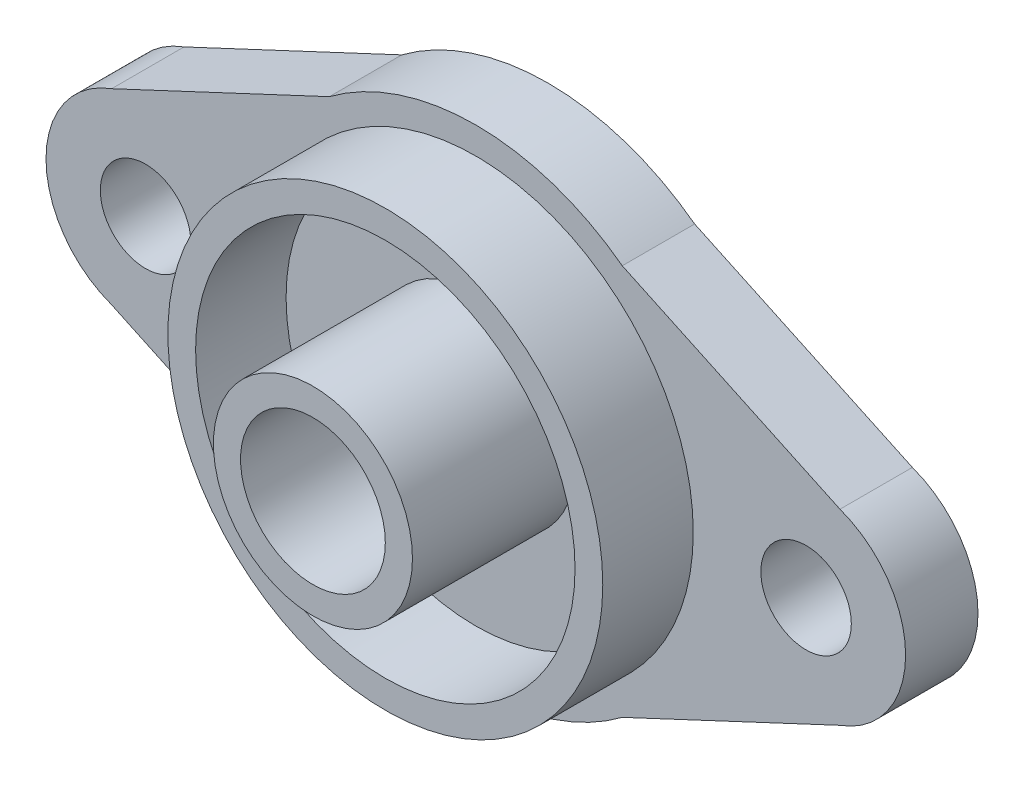
ISO-10303-21;
HEADER;
FILE_DESCRIPTION(('STEP AP214'),'2;1');
FILE_NAME('part.step','',(''),(''),'','','');
FILE_SCHEMA(('AUTOMOTIVE_DESIGN { 1 0 10303 214 1 1 1 1 }'));
ENDSEC;
DATA;
#1=APPLICATION_CONTEXT('core data for automotive mechanical design processes');
#2=APPLICATION_PROTOCOL_DEFINITION('international standard','automotive_design',2000,#1);
#3=PRODUCT_CONTEXT('',#1,'mechanical');
#4=PRODUCT('Part','Part','',(#3));
#5=PRODUCT_RELATED_PRODUCT_CATEGORY('part','',(#4));
#6=PRODUCT_DEFINITION_FORMATION('','',#4);
#7=PRODUCT_DEFINITION_CONTEXT('part definition',#1,'design');
#8=PRODUCT_DEFINITION('design','',#6,#7);
#9=PRODUCT_DEFINITION_SHAPE('','',#8);
#10=(LENGTH_UNIT() NAMED_UNIT(*) SI_UNIT(.MILLI.,.METRE.));
#11=(NAMED_UNIT(*) PLANE_ANGLE_UNIT() SI_UNIT($,.RADIAN.));
#12=(NAMED_UNIT(*) SI_UNIT($,.STERADIAN.) SOLID_ANGLE_UNIT());
#13=UNCERTAINTY_MEASURE_WITH_UNIT(LENGTH_MEASURE(1.E-05),#10,'distance_accuracy_value','');
#14=(GEOMETRIC_REPRESENTATION_CONTEXT(3) GLOBAL_UNCERTAINTY_ASSIGNED_CONTEXT((#13)) GLOBAL_UNIT_ASSIGNED_CONTEXT((#10,
#11,#12)) REPRESENTATION_CONTEXT('',''));
#15=CARTESIAN_POINT('',(0.,0.,0.));
#16=DIRECTION('',(0.,0.,1.));
#17=DIRECTION('',(1.,0.,0.));
#18=AXIS2_PLACEMENT_3D('',#15,#16,#17);
#19=CARTESIAN_POINT('',(0.,0.,4.));
#20=DIRECTION('',(0.,0.,1.));
#21=DIRECTION('',(1.,0.,0.));
#22=AXIS2_PLACEMENT_3D('',#19,#20,#21);
#23=PLANE('',#22);
#24=CARTESIAN_POINT('',(0.,0.,4.));
#25=DIRECTION('',(0.,0.,1.));
#26=DIRECTION('',(1.,0.,0.));
#27=AXIS2_PLACEMENT_3D('',#24,#25,#26);
#28=CIRCLE('',#27,10.4838418302343);
#29=CARTESIAN_POINT('',(10.4838418302343,0.,4.));
#30=VERTEX_POINT('',#29);
#31=EDGE_CURVE('E11',#30,#30,#28,.F.);
#32=ORIENTED_EDGE('',*,*,#31,.F.);
#33=EDGE_LOOP('',(#32));
#34=FACE_BOUND('',#33,.T.);
#35=CARTESIAN_POINT('',(0.,0.,4.));
#36=DIRECTION('',(0.,0.,1.));
#37=DIRECTION('',(1.,0.,0.));
#38=AXIS2_PLACEMENT_3D('',#35,#36,#37);
#39=CIRCLE('',#38,5.5);
#40=CARTESIAN_POINT('',(5.5,0.,4.));
#41=VERTEX_POINT('',#40);
#42=EDGE_CURVE('E210',#41,#41,#39,.T.);
#43=ORIENTED_EDGE('',*,*,#42,.F.);
#44=EDGE_LOOP('',(#43));
#45=FACE_BOUND('',#44,.T.);
#46=ADVANCED_FACE('F34',(#34,#45),#23,.T.);
#47=CARTESIAN_POINT('',(0.,0.,4.));
#48=DIRECTION('',(0.,0.,1.));
#49=DIRECTION('',(1.,0.,0.));
#50=AXIS2_PLACEMENT_3D('',#47,#48,#49);
#51=CIRCLE('',#50,12.0157010316924);
#52=CARTESIAN_POINT('',(12.0157010316924,0.,4.));
#53=VERTEX_POINT('',#52);
#54=EDGE_CURVE('E201',#53,#53,#51,.T.);
#55=ORIENTED_EDGE('',*,*,#54,.F.);
#56=EDGE_LOOP('',(#55));
#57=FACE_BOUND('',#56,.T.);
#58=CARTESIAN_POINT('',(-18.25,0.,4.));
#59=DIRECTION('',(0.,0.,1.));
#60=DIRECTION('',(1.,0.,0.));
#61=AXIS2_PLACEMENT_3D('',#58,#59,#60);
#62=CIRCLE('',#61,2.5);
#63=CARTESIAN_POINT('',(-15.75,0.,4.));
#64=VERTEX_POINT('',#63);
#65=EDGE_CURVE('E188',#64,#64,#62,.T.);
#66=ORIENTED_EDGE('',*,*,#65,.F.);
#67=EDGE_LOOP('',(#66));
#68=FACE_BOUND('',#67,.T.);
#69=CARTESIAN_POINT('',(0.,0.,4.));
#70=DIRECTION('',(0.,0.,1.));
#71=DIRECTION('',(1.,0.,0.));
#72=AXIS2_PLACEMENT_3D('',#69,#70,#71);
#73=CIRCLE('',#72,13.5);
#74=CARTESIAN_POINT('',(8.09371855645499,10.8047082296976,4.));
#75=VERTEX_POINT('',#74);
#76=CARTESIAN_POINT('',(-8.09371855645499,10.8047082296976,4.));
#77=VERTEX_POINT('',#76);
#78=EDGE_CURVE('E148',#75,#77,#73,.T.);
#79=ORIENTED_EDGE('',*,*,#78,.T.);
#80=DIRECTION('',(-0.905614457047398,-0.424101939616817,0.));
#81=VECTOR('',#80,1.);
#82=CARTESIAN_POINT('',(-20.1239972704098,5.17089298192262,4.));
#83=LINE('',#82,#81);
#84=CARTESIAN_POINT('',(-20.1239972704098,5.17089298192262,4.));
#85=VERTEX_POINT('',#84);
#86=EDGE_CURVE('E95',#77,#85,#83,.T.);
#87=ORIENTED_EDGE('',*,*,#86,.T.);
#88=CARTESIAN_POINT('',(-18.25,0.,4.));
#89=DIRECTION('',(0.,0.,1.));
#90=DIRECTION('',(1.,0.,0.));
#91=AXIS2_PLACEMENT_3D('',#88,#89,#90);
#92=CIRCLE('',#91,5.5);
#93=CARTESIAN_POINT('',(-20.1239972704098,-5.17089298192262,4.));
#94=VERTEX_POINT('',#93);
#95=EDGE_CURVE('E180',#85,#94,#92,.T.);
#96=ORIENTED_EDGE('',*,*,#95,.T.);
#97=DIRECTION('',(0.905614457047398,-0.424101939616817,0.));
#98=VECTOR('',#97,1.);
#99=CARTESIAN_POINT('',(-20.1239972704098,-5.17089298192262,4.));
#100=LINE('',#99,#98);
#101=CARTESIAN_POINT('',(-8.09371855645499,-10.8047082296976,4.));
#102=VERTEX_POINT('',#101);
#103=EDGE_CURVE('E179',#94,#102,#100,.T.);
#104=ORIENTED_EDGE('',*,*,#103,.T.);
#105=CARTESIAN_POINT('',(0.,0.,4.));
#106=DIRECTION('',(0.,0.,1.));
#107=DIRECTION('',(-1.,0.,0.));
#108=AXIS2_PLACEMENT_3D('',#105,#106,#107);
#109=CIRCLE('',#108,13.5);
#110=CARTESIAN_POINT('',(8.093718556455,-10.8047082296976,4.));
#111=VERTEX_POINT('',#110);
#112=EDGE_CURVE('E115',#102,#111,#109,.T.);
#113=ORIENTED_EDGE('',*,*,#112,.T.);
#114=DIRECTION('',(0.905614457047398,0.424101939616817,0.));
#115=VECTOR('',#114,1.);
#116=CARTESIAN_POINT('',(20.1239972704098,-5.17089298192262,4.));
#117=LINE('',#116,#115);
#118=CARTESIAN_POINT('',(20.1239972704098,-5.17089298192262,4.));
#119=VERTEX_POINT('',#118);
#120=EDGE_CURVE('E108',#111,#119,#117,.T.);
#121=ORIENTED_EDGE('',*,*,#120,.T.);
#122=CARTESIAN_POINT('',(18.25,0.,4.));
#123=DIRECTION('',(0.,0.,1.));
#124=DIRECTION('',(-1.,0.,0.));
#125=AXIS2_PLACEMENT_3D('',#122,#123,#124);
#126=CIRCLE('',#125,5.5);
#127=CARTESIAN_POINT('',(20.1239972704098,5.17089298192262,4.));
#128=VERTEX_POINT('',#127);
#129=EDGE_CURVE('E113',#119,#128,#126,.T.);
#130=ORIENTED_EDGE('',*,*,#129,.T.);
#131=DIRECTION('',(-0.905614457047398,0.424101939616817,0.));
#132=VECTOR('',#131,1.);
#133=CARTESIAN_POINT('',(20.1239972704098,5.17089298192262,4.));
#134=LINE('',#133,#132);
#135=EDGE_CURVE('E51',#128,#75,#134,.T.);
#136=ORIENTED_EDGE('',*,*,#135,.T.);
#137=EDGE_LOOP('',(#79,#87,#96,#104,#113,#121,#130,#136));
#138=FACE_BOUND('',#137,.T.);
#139=CARTESIAN_POINT('',(18.25,0.,4.));
#140=DIRECTION('',(0.,0.,1.));
#141=DIRECTION('',(1.,0.,0.));
#142=AXIS2_PLACEMENT_3D('',#139,#140,#141);
#143=CIRCLE('',#142,2.5);
#144=CARTESIAN_POINT('',(20.75,0.,4.));
#145=VERTEX_POINT('',#144);
#146=EDGE_CURVE('E192',#145,#145,#143,.T.);
#147=ORIENTED_EDGE('',*,*,#146,.F.);
#148=EDGE_LOOP('',(#147));
#149=FACE_BOUND('',#148,.T.);
#150=ADVANCED_FACE('F110',(#57,#68,#138,#149),#23,.T.);
#151=CARTESIAN_POINT('',(0.,0.,0.));
#152=DIRECTION('',(0.,0.,1.));
#153=DIRECTION('',(1.,0.,0.));
#154=AXIS2_PLACEMENT_3D('',#151,#152,#153);
#155=PLANE('',#154);
#156=CARTESIAN_POINT('',(0.,0.,0.));
#157=DIRECTION('',(0.,0.,1.));
#158=DIRECTION('',(1.,0.,0.));
#159=AXIS2_PLACEMENT_3D('',#156,#157,#158);
#160=CIRCLE('',#159,13.5);
#161=CARTESIAN_POINT('',(8.09371855645499,10.8047082296976,0.));
#162=VERTEX_POINT('',#161);
#163=CARTESIAN_POINT('',(-8.09371855645499,10.8047082296976,0.));
#164=VERTEX_POINT('',#163);
#165=EDGE_CURVE('E133',#162,#164,#160,.T.);
#166=ORIENTED_EDGE('',*,*,#165,.F.);
#167=DIRECTION('',(-0.905614457047398,0.424101939616817,0.));
#168=VECTOR('',#167,1.);
#169=CARTESIAN_POINT('',(20.1239972704098,5.17089298192262,0.));
#170=LINE('',#169,#168);
#171=CARTESIAN_POINT('',(20.1239972704098,5.17089298192262,0.));
#172=VERTEX_POINT('',#171);
#173=EDGE_CURVE('E86',#172,#162,#170,.T.);
#174=ORIENTED_EDGE('',*,*,#173,.F.);
#175=CARTESIAN_POINT('',(18.25,0.,0.));
#176=DIRECTION('',(0.,0.,1.));
#177=DIRECTION('',(-1.,0.,0.));
#178=AXIS2_PLACEMENT_3D('',#175,#176,#177);
#179=CIRCLE('',#178,5.5);
#180=CARTESIAN_POINT('',(20.1239972704098,-5.17089298192262,0.));
#181=VERTEX_POINT('',#180);
#182=EDGE_CURVE('E80',#181,#172,#179,.T.);
#183=ORIENTED_EDGE('',*,*,#182,.F.);
#184=DIRECTION('',(0.905614457047398,0.424101939616817,0.));
#185=VECTOR('',#184,1.);
#186=CARTESIAN_POINT('',(20.1239972704098,-5.17089298192262,0.));
#187=LINE('',#186,#185);
#188=CARTESIAN_POINT('',(8.093718556455,-10.8047082296976,0.));
#189=VERTEX_POINT('',#188);
#190=EDGE_CURVE('E123',#189,#181,#187,.T.);
#191=ORIENTED_EDGE('',*,*,#190,.F.);
#192=CARTESIAN_POINT('',(0.,0.,0.));
#193=DIRECTION('',(0.,0.,1.));
#194=DIRECTION('',(-1.,0.,0.));
#195=AXIS2_PLACEMENT_3D('',#192,#193,#194);
#196=CIRCLE('',#195,13.5);
#197=CARTESIAN_POINT('',(-8.09371855645499,-10.8047082296976,0.));
#198=VERTEX_POINT('',#197);
#199=EDGE_CURVE('E143',#198,#189,#196,.T.);
#200=ORIENTED_EDGE('',*,*,#199,.F.);
#201=DIRECTION('',(0.905614457047398,-0.424101939616817,0.));
#202=VECTOR('',#201,1.);
#203=CARTESIAN_POINT('',(-20.1239972704098,-5.17089298192262,0.));
#204=LINE('',#203,#202);
#205=CARTESIAN_POINT('',(-20.1239972704098,-5.17089298192262,0.));
#206=VERTEX_POINT('',#205);
#207=EDGE_CURVE('E141',#206,#198,#204,.T.);
#208=ORIENTED_EDGE('',*,*,#207,.F.);
#209=CARTESIAN_POINT('',(-18.25,0.,0.));
#210=DIRECTION('',(0.,0.,1.));
#211=DIRECTION('',(1.,0.,0.));
#212=AXIS2_PLACEMENT_3D('',#209,#210,#211);
#213=CIRCLE('',#212,5.5);
#214=CARTESIAN_POINT('',(-20.1239972704098,5.17089298192262,0.));
#215=VERTEX_POINT('',#214);
#216=EDGE_CURVE('E139',#215,#206,#213,.T.);
#217=ORIENTED_EDGE('',*,*,#216,.F.);
#218=DIRECTION('',(-0.905614457047398,-0.424101939616817,0.));
#219=VECTOR('',#218,1.);
#220=CARTESIAN_POINT('',(-20.1239972704098,5.17089298192262,0.));
#221=LINE('',#220,#219);
#222=EDGE_CURVE('E136',#164,#215,#221,.T.);
#223=ORIENTED_EDGE('',*,*,#222,.F.);
#224=EDGE_LOOP('',(#166,#174,#183,#191,#200,#208,#217,#223));
#225=FACE_BOUND('',#224,.T.);
#226=CARTESIAN_POINT('',(0.,0.,0.));
#227=DIRECTION('',(0.,0.,1.));
#228=DIRECTION('',(1.,0.,0.));
#229=AXIS2_PLACEMENT_3D('',#226,#227,#228);
#230=CIRCLE('',#229,4.);
#231=CARTESIAN_POINT('',(4.,0.,0.));
#232=VERTEX_POINT('',#231);
#233=EDGE_CURVE('E137',#232,#232,#230,.T.);
#234=ORIENTED_EDGE('',*,*,#233,.T.);
#235=EDGE_LOOP('',(#234));
#236=FACE_BOUND('',#235,.T.);
#237=CARTESIAN_POINT('',(-18.25,0.,0.));
#238=DIRECTION('',(0.,0.,1.));
#239=DIRECTION('',(1.,0.,0.));
#240=AXIS2_PLACEMENT_3D('',#237,#238,#239);
#241=CIRCLE('',#240,2.5);
#242=CARTESIAN_POINT('',(-15.75,0.,0.));
#243=VERTEX_POINT('',#242);
#244=EDGE_CURVE('E189',#243,#243,#241,.T.);
#245=ORIENTED_EDGE('',*,*,#244,.T.);
#246=EDGE_LOOP('',(#245));
#247=FACE_BOUND('',#246,.T.);
#248=CARTESIAN_POINT('',(18.25,0.,0.));
#249=DIRECTION('',(0.,0.,1.));
#250=DIRECTION('',(1.,0.,0.));
#251=AXIS2_PLACEMENT_3D('',#248,#249,#250);
#252=CIRCLE('',#251,2.5);
#253=CARTESIAN_POINT('',(20.75,0.,0.));
#254=VERTEX_POINT('',#253);
#255=EDGE_CURVE('E195',#254,#254,#252,.T.);
#256=ORIENTED_EDGE('',*,*,#255,.T.);
#257=EDGE_LOOP('',(#256));
#258=FACE_BOUND('',#257,.T.);
#259=ADVANCED_FACE('F166',(#225,#236,#247,#258),#155,.F.);
#260=CARTESIAN_POINT('',(0.,0.,4.));
#261=DIRECTION('',(0.,0.,-1.));
#262=DIRECTION('',(-1.,0.,0.));
#263=AXIS2_PLACEMENT_3D('',#260,#261,#262);
#264=CYLINDRICAL_SURFACE('',#263,13.5);
#265=ORIENTED_EDGE('',*,*,#165,.T.);
#266=DIRECTION('',(0.,0.,-1.));
#267=VECTOR('',#266,1.);
#268=CARTESIAN_POINT('',(-8.09371855645499,10.8047082296976,4.));
#269=LINE('',#268,#267);
#270=EDGE_CURVE('E43',#77,#164,#269,.T.);
#271=ORIENTED_EDGE('',*,*,#270,.F.);
#272=ORIENTED_EDGE('',*,*,#78,.F.);
#273=DIRECTION('',(0.,0.,-1.));
#274=VECTOR('',#273,1.);
#275=CARTESIAN_POINT('',(8.09371855645499,10.8047082296976,4.));
#276=LINE('',#275,#274);
#277=EDGE_CURVE('E129',#75,#162,#276,.T.);
#278=ORIENTED_EDGE('',*,*,#277,.T.);
#279=EDGE_LOOP('',(#265,#271,#272,#278));
#280=FACE_BOUND('',#279,.T.);
#281=ADVANCED_FACE('F36',(#280),#264,.T.);
#282=CARTESIAN_POINT('',(-20.1239972704098,5.17089298192262,4.));
#283=DIRECTION('',(0.424101939616817,-0.905614457047398,0.));
#284=DIRECTION('',(0.905614457047398,0.424101939616817,0.));
#285=AXIS2_PLACEMENT_3D('',#282,#283,#284);
#286=PLANE('',#285);
#287=ORIENTED_EDGE('',*,*,#222,.T.);
#288=DIRECTION('',(0.,0.,-1.));
#289=VECTOR('',#288,1.);
#290=CARTESIAN_POINT('',(-20.1239972704098,5.17089298192262,4.));
#291=LINE('',#290,#289);
#292=EDGE_CURVE('E158',#85,#215,#291,.T.);
#293=ORIENTED_EDGE('',*,*,#292,.F.);
#294=ORIENTED_EDGE('',*,*,#86,.F.);
#295=ORIENTED_EDGE('',*,*,#270,.T.);
#296=EDGE_LOOP('',(#287,#293,#294,#295));
#297=FACE_BOUND('',#296,.T.);
#298=ADVANCED_FACE('F161',(#297),#286,.F.);
#299=CARTESIAN_POINT('',(-18.25,0.,4.));
#300=DIRECTION('',(0.,0.,-1.));
#301=DIRECTION('',(-1.,0.,0.));
#302=AXIS2_PLACEMENT_3D('',#299,#300,#301);
#303=CYLINDRICAL_SURFACE('',#302,5.5);
#304=ORIENTED_EDGE('',*,*,#216,.T.);
#305=DIRECTION('',(0.,0.,-1.));
#306=VECTOR('',#305,1.);
#307=CARTESIAN_POINT('',(-20.1239972704098,-5.17089298192262,4.));
#308=LINE('',#307,#306);
#309=EDGE_CURVE('E155',#94,#206,#308,.T.);
#310=ORIENTED_EDGE('',*,*,#309,.F.);
#311=ORIENTED_EDGE('',*,*,#95,.F.);
#312=ORIENTED_EDGE('',*,*,#292,.T.);
#313=EDGE_LOOP('',(#304,#310,#311,#312));
#314=FACE_BOUND('',#313,.T.);
#315=ADVANCED_FACE('F173',(#314),#303,.T.);
#316=CARTESIAN_POINT('',(-20.1239972704098,-5.17089298192262,4.));
#317=DIRECTION('',(0.424101939616817,0.905614457047398,0.));
#318=DIRECTION('',(-0.905614457047398,0.424101939616817,0.));
#319=AXIS2_PLACEMENT_3D('',#316,#317,#318);
#320=PLANE('',#319);
#321=ORIENTED_EDGE('',*,*,#207,.T.);
#322=DIRECTION('',(0.,0.,-1.));
#323=VECTOR('',#322,1.);
#324=CARTESIAN_POINT('',(-8.09371855645499,-10.8047082296976,4.));
#325=LINE('',#324,#323);
#326=EDGE_CURVE('E152',#102,#198,#325,.T.);
#327=ORIENTED_EDGE('',*,*,#326,.F.);
#328=ORIENTED_EDGE('',*,*,#103,.F.);
#329=ORIENTED_EDGE('',*,*,#309,.T.);
#330=EDGE_LOOP('',(#321,#327,#328,#329));
#331=FACE_BOUND('',#330,.T.);
#332=ADVANCED_FACE('F177',(#331),#320,.F.);
#333=CARTESIAN_POINT('',(0.,0.,4.));
#334=DIRECTION('',(0.,0.,-1.));
#335=DIRECTION('',(-1.,0.,0.));
#336=AXIS2_PLACEMENT_3D('',#333,#334,#335);
#337=CYLINDRICAL_SURFACE('',#336,13.5);
#338=ORIENTED_EDGE('',*,*,#199,.T.);
#339=DIRECTION('',(0.,0.,-1.));
#340=VECTOR('',#339,1.);
#341=CARTESIAN_POINT('',(8.093718556455,-10.8047082296976,4.));
#342=LINE('',#341,#340);
#343=EDGE_CURVE('E124',#111,#189,#342,.T.);
#344=ORIENTED_EDGE('',*,*,#343,.F.);
#345=ORIENTED_EDGE('',*,*,#112,.F.);
#346=ORIENTED_EDGE('',*,*,#326,.T.);
#347=EDGE_LOOP('',(#338,#344,#345,#346));
#348=FACE_BOUND('',#347,.T.);
#349=ADVANCED_FACE('F257',(#348),#337,.T.);
#350=CARTESIAN_POINT('',(20.1239972704098,-5.17089298192262,4.));
#351=DIRECTION('',(-0.424101939616817,0.905614457047398,0.));
#352=DIRECTION('',(-0.905614457047398,-0.424101939616817,0.));
#353=AXIS2_PLACEMENT_3D('',#350,#351,#352);
#354=PLANE('',#353);
#355=ORIENTED_EDGE('',*,*,#190,.T.);
#356=DIRECTION('',(0.,0.,-1.));
#357=VECTOR('',#356,1.);
#358=CARTESIAN_POINT('',(20.1239972704098,-5.17089298192262,4.));
#359=LINE('',#358,#357);
#360=EDGE_CURVE('E120',#119,#181,#359,.T.);
#361=ORIENTED_EDGE('',*,*,#360,.F.);
#362=ORIENTED_EDGE('',*,*,#120,.F.);
#363=ORIENTED_EDGE('',*,*,#343,.T.);
#364=EDGE_LOOP('',(#355,#361,#362,#363));
#365=FACE_BOUND('',#364,.T.);
#366=ADVANCED_FACE('F121',(#365),#354,.F.);
#367=CARTESIAN_POINT('',(18.25,0.,4.));
#368=DIRECTION('',(0.,0.,-1.));
#369=DIRECTION('',(-1.,0.,0.));
#370=AXIS2_PLACEMENT_3D('',#367,#368,#369);
#371=CYLINDRICAL_SURFACE('',#370,5.5);
#372=ORIENTED_EDGE('',*,*,#182,.T.);
#373=DIRECTION('',(0.,0.,-1.));
#374=VECTOR('',#373,1.);
#375=CARTESIAN_POINT('',(20.1239972704098,5.17089298192262,4.));
#376=LINE('',#375,#374);
#377=EDGE_CURVE('E125',#128,#172,#376,.T.);
#378=ORIENTED_EDGE('',*,*,#377,.F.);
#379=ORIENTED_EDGE('',*,*,#129,.F.);
#380=ORIENTED_EDGE('',*,*,#360,.T.);
#381=EDGE_LOOP('',(#372,#378,#379,#380));
#382=FACE_BOUND('',#381,.T.);
#383=ADVANCED_FACE('F127',(#382),#371,.T.);
#384=CARTESIAN_POINT('',(20.1239972704098,5.17089298192262,4.));
#385=DIRECTION('',(-0.424101939616817,-0.905614457047398,0.));
#386=DIRECTION('',(0.905614457047398,-0.424101939616817,0.));
#387=AXIS2_PLACEMENT_3D('',#384,#385,#386);
#388=PLANE('',#387);
#389=ORIENTED_EDGE('',*,*,#173,.T.);
#390=ORIENTED_EDGE('',*,*,#277,.F.);
#391=ORIENTED_EDGE('',*,*,#135,.F.);
#392=ORIENTED_EDGE('',*,*,#377,.T.);
#393=EDGE_LOOP('',(#389,#390,#391,#392));
#394=FACE_BOUND('',#393,.T.);
#395=ADVANCED_FACE('F250',(#394),#388,.F.);
#396=CARTESIAN_POINT('',(0.,0.,4.));
#397=DIRECTION('',(0.,0.,-1.));
#398=DIRECTION('',(-1.,0.,0.));
#399=AXIS2_PLACEMENT_3D('',#396,#397,#398);
#400=CYLINDRICAL_SURFACE('',#399,4.);
#401=ORIENTED_EDGE('',*,*,#233,.F.);
#402=EDGE_LOOP('',(#401));
#403=FACE_BOUND('',#402,.T.);
#404=CARTESIAN_POINT('',(0.,0.,13.));
#405=DIRECTION('',(0.,0.,1.));
#406=DIRECTION('',(1.,0.,0.));
#407=AXIS2_PLACEMENT_3D('',#404,#405,#406);
#408=CIRCLE('',#407,4.);
#409=CARTESIAN_POINT('',(4.,0.,13.));
#410=VERTEX_POINT('',#409);
#411=EDGE_CURVE('E213',#410,#410,#408,.T.);
#412=ORIENTED_EDGE('',*,*,#411,.T.);
#413=EDGE_LOOP('',(#412));
#414=FACE_BOUND('',#413,.T.);
#415=ADVANCED_FACE('F219',(#403,#414),#400,.F.);
#416=CARTESIAN_POINT('',(-18.25,0.,4.));
#417=DIRECTION('',(0.,0.,-1.));
#418=DIRECTION('',(-1.,0.,0.));
#419=AXIS2_PLACEMENT_3D('',#416,#417,#418);
#420=CYLINDRICAL_SURFACE('',#419,2.5);
#421=ORIENTED_EDGE('',*,*,#65,.T.);
#422=EDGE_LOOP('',(#421));
#423=FACE_BOUND('',#422,.T.);
#424=ORIENTED_EDGE('',*,*,#244,.F.);
#425=EDGE_LOOP('',(#424));
#426=FACE_BOUND('',#425,.T.);
#427=ADVANCED_FACE('F321',(#423,#426),#420,.F.);
#428=CARTESIAN_POINT('',(18.25,0.,4.));
#429=DIRECTION('',(0.,0.,-1.));
#430=DIRECTION('',(-1.,0.,0.));
#431=AXIS2_PLACEMENT_3D('',#428,#429,#430);
#432=CYLINDRICAL_SURFACE('',#431,2.5);
#433=ORIENTED_EDGE('',*,*,#146,.T.);
#434=EDGE_LOOP('',(#433));
#435=FACE_BOUND('',#434,.T.);
#436=ORIENTED_EDGE('',*,*,#255,.F.);
#437=EDGE_LOOP('',(#436));
#438=FACE_BOUND('',#437,.T.);
#439=ADVANCED_FACE('F284',(#435,#438),#432,.F.);
#440=CARTESIAN_POINT('',(0.,0.,9.));
#441=DIRECTION('',(0.,0.,1.));
#442=DIRECTION('',(1.,0.,0.));
#443=AXIS2_PLACEMENT_3D('',#440,#441,#442);
#444=PLANE('',#443);
#445=CARTESIAN_POINT('',(0.,0.,9.));
#446=DIRECTION('',(0.,0.,1.));
#447=DIRECTION('',(1.,0.,0.));
#448=AXIS2_PLACEMENT_3D('',#445,#446,#447);
#449=CIRCLE('',#448,12.0157010316924);
#450=CARTESIAN_POINT('',(12.0157010316924,0.,9.));
#451=VERTEX_POINT('',#450);
#452=EDGE_CURVE('E198',#451,#451,#449,.T.);
#453=ORIENTED_EDGE('',*,*,#452,.T.);
#454=EDGE_LOOP('',(#453));
#455=FACE_BOUND('',#454,.T.);
#456=CARTESIAN_POINT('',(0.,0.,9.));
#457=DIRECTION('',(0.,0.,1.));
#458=DIRECTION('',(1.,0.,0.));
#459=AXIS2_PLACEMENT_3D('',#456,#457,#458);
#460=CIRCLE('',#459,10.4838418302343);
#461=CARTESIAN_POINT('',(10.4838418302343,0.,9.));
#462=VERTEX_POINT('',#461);
#463=EDGE_CURVE('E204',#462,#462,#460,.T.);
#464=ORIENTED_EDGE('',*,*,#463,.F.);
#465=EDGE_LOOP('',(#464));
#466=FACE_BOUND('',#465,.T.);
#467=ADVANCED_FACE('F289',(#455,#466),#444,.T.);
#468=CARTESIAN_POINT('',(0.,0.,9.));
#469=DIRECTION('',(0.,0.,-1.));
#470=DIRECTION('',(-1.,0.,0.));
#471=AXIS2_PLACEMENT_3D('',#468,#469,#470);
#472=CYLINDRICAL_SURFACE('',#471,12.0157010316924);
#473=ORIENTED_EDGE('',*,*,#452,.F.);
#474=EDGE_LOOP('',(#473));
#475=FACE_BOUND('',#474,.T.);
#476=ORIENTED_EDGE('',*,*,#54,.T.);
#477=EDGE_LOOP('',(#476));
#478=FACE_BOUND('',#477,.T.);
#479=ADVANCED_FACE('F233',(#475,#478),#472,.T.);
#480=CARTESIAN_POINT('',(0.,0.,9.));
#481=DIRECTION('',(0.,0.,-1.));
#482=DIRECTION('',(-1.,0.,0.));
#483=AXIS2_PLACEMENT_3D('',#480,#481,#482);
#484=CYLINDRICAL_SURFACE('',#483,10.4838418302343);
#485=ORIENTED_EDGE('',*,*,#463,.T.);
#486=EDGE_LOOP('',(#485));
#487=FACE_BOUND('',#486,.T.);
#488=ORIENTED_EDGE('',*,*,#31,.T.);
#489=EDGE_LOOP('',(#488));
#490=FACE_BOUND('',#489,.T.);
#491=ADVANCED_FACE('F224',(#487,#490),#484,.F.);
#492=CARTESIAN_POINT('',(0.,0.,13.));
#493=DIRECTION('',(0.,0.,1.));
#494=DIRECTION('',(1.,0.,0.));
#495=AXIS2_PLACEMENT_3D('',#492,#493,#494);
#496=PLANE('',#495);
#497=CARTESIAN_POINT('',(0.,0.,13.));
#498=DIRECTION('',(0.,0.,1.));
#499=DIRECTION('',(1.,0.,0.));
#500=AXIS2_PLACEMENT_3D('',#497,#498,#499);
#501=CIRCLE('',#500,5.5);
#502=CARTESIAN_POINT('',(5.5,0.,13.));
#503=VERTEX_POINT('',#502);
#504=EDGE_CURVE('E209',#503,#503,#501,.T.);
#505=ORIENTED_EDGE('',*,*,#504,.T.);
#506=EDGE_LOOP('',(#505));
#507=FACE_BOUND('',#506,.T.);
#508=ORIENTED_EDGE('',*,*,#411,.F.);
#509=EDGE_LOOP('',(#508));
#510=FACE_BOUND('',#509,.T.);
#511=ADVANCED_FACE('F221',(#507,#510),#496,.T.);
#512=CARTESIAN_POINT('',(0.,0.,13.));
#513=DIRECTION('',(0.,0.,-1.));
#514=DIRECTION('',(-1.,0.,0.));
#515=AXIS2_PLACEMENT_3D('',#512,#513,#514);
#516=CYLINDRICAL_SURFACE('',#515,5.5);
#517=ORIENTED_EDGE('',*,*,#504,.F.);
#518=EDGE_LOOP('',(#517));
#519=FACE_BOUND('',#518,.T.);
#520=ORIENTED_EDGE('',*,*,#42,.T.);
#521=EDGE_LOOP('',(#520));
#522=FACE_BOUND('',#521,.T.);
#523=ADVANCED_FACE('F223',(#519,#522),#516,.T.);
#524=CLOSED_SHELL('',(#46,#150,#259,#281,#298,#315,#332,#349,#366,#383,#395,#415,#427,#439,#467,
#479,#491,#511,#523));
#525=MANIFOLD_SOLID_BREP('B2',#524);
#526=ADVANCED_BREP_SHAPE_REPRESENTATION('',(#18,#525),#14);
#527=SHAPE_DEFINITION_REPRESENTATION(#9,#526);
ENDSEC;
END-ISO-10303-21;
